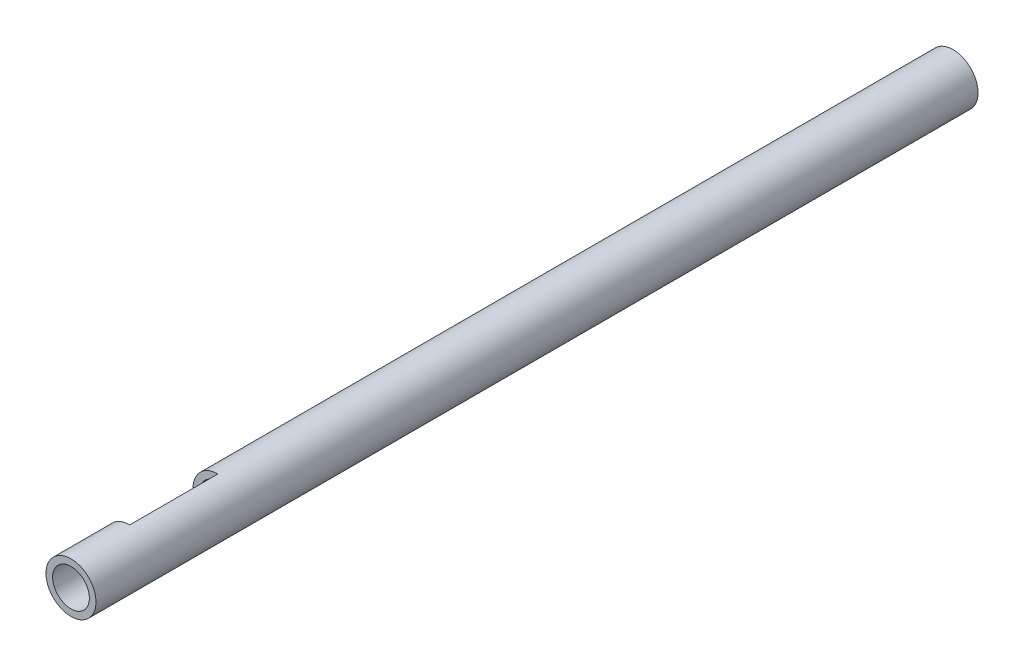
ISO-10303-21;
HEADER;
FILE_DESCRIPTION(('STEP AP214'),'2;1');
FILE_NAME('part.step','',(''),(''),'','','');
FILE_SCHEMA(('AUTOMOTIVE_DESIGN { 1 0 10303 214 1 1 1 1 }'));
ENDSEC;
DATA;
#1=APPLICATION_CONTEXT('core data for automotive mechanical design processes');
#2=APPLICATION_PROTOCOL_DEFINITION('international standard','automotive_design',2000,#1);
#3=PRODUCT_CONTEXT('',#1,'mechanical');
#4=PRODUCT('Part','Part','',(#3));
#5=PRODUCT_RELATED_PRODUCT_CATEGORY('part','',(#4));
#6=PRODUCT_DEFINITION_FORMATION('','',#4);
#7=PRODUCT_DEFINITION_CONTEXT('part definition',#1,'design');
#8=PRODUCT_DEFINITION('design','',#6,#7);
#9=PRODUCT_DEFINITION_SHAPE('','',#8);
#10=(LENGTH_UNIT() NAMED_UNIT(*) SI_UNIT(.MILLI.,.METRE.));
#11=(NAMED_UNIT(*) PLANE_ANGLE_UNIT() SI_UNIT($,.RADIAN.));
#12=(NAMED_UNIT(*) SI_UNIT($,.STERADIAN.) SOLID_ANGLE_UNIT());
#13=UNCERTAINTY_MEASURE_WITH_UNIT(LENGTH_MEASURE(1.E-05),#10,'distance_accuracy_value','');
#14=(GEOMETRIC_REPRESENTATION_CONTEXT(3) GLOBAL_UNCERTAINTY_ASSIGNED_CONTEXT((#13)) GLOBAL_UNIT_ASSIGNED_CONTEXT((#10,
#11,#12)) REPRESENTATION_CONTEXT('',''));
#15=CARTESIAN_POINT('',(0.,0.,0.));
#16=DIRECTION('',(0.,0.,1.));
#17=DIRECTION('',(1.,0.,0.));
#18=AXIS2_PLACEMENT_3D('',#15,#16,#17);
#19=CARTESIAN_POINT('',(0.,17.,0.));
#20=DIRECTION('',(0.,0.,-1.));
#21=DIRECTION('',(-1.,0.,0.));
#22=AXIS2_PLACEMENT_3D('',#19,#20,#21);
#23=PLANE('',#22);
#24=CARTESIAN_POINT('',(0.,0.,0.));
#25=DIRECTION('',(0.,0.,-1.));
#26=DIRECTION('',(-1.,0.,0.));
#27=AXIS2_PLACEMENT_3D('',#24,#25,#26);
#28=CIRCLE('',#27,17.);
#29=CARTESIAN_POINT('',(-17.,0.,0.));
#30=VERTEX_POINT('',#29);
#31=EDGE_CURVE('E103',#30,#30,#28,.T.);
#32=ORIENTED_EDGE('',*,*,#31,.T.);
#33=EDGE_LOOP('',(#32));
#34=FACE_BOUND('',#33,.T.);
#35=CARTESIAN_POINT('',(0.,0.,0.));
#36=DIRECTION('',(0.,0.,-1.));
#37=DIRECTION('',(-1.,0.,0.));
#38=AXIS2_PLACEMENT_3D('',#35,#36,#37);
#39=CIRCLE('',#38,12.5);
#40=CARTESIAN_POINT('',(-12.5,0.,0.));
#41=VERTEX_POINT('',#40);
#42=EDGE_CURVE('E112',#41,#41,#39,.T.);
#43=ORIENTED_EDGE('',*,*,#42,.F.);
#44=EDGE_LOOP('',(#43));
#45=FACE_BOUND('',#44,.T.);
#46=ADVANCED_FACE('F33',(#34,#45),#23,.T.);
#47=CARTESIAN_POINT('',(0.,0.,0.));
#48=DIRECTION('',(0.,0.,-1.));
#49=DIRECTION('',(-1.,0.,0.));
#50=AXIS2_PLACEMENT_3D('',#47,#48,#49);
#51=CYLINDRICAL_SURFACE('',#50,12.5);
#52=CARTESIAN_POINT('',(0.,0.,500.));
#53=DIRECTION('',(0.,0.,-1.));
#54=DIRECTION('',(-1.,0.,0.));
#55=AXIS2_PLACEMENT_3D('',#52,#53,#54);
#56=CIRCLE('',#55,12.5);
#57=CARTESIAN_POINT('',(0.,-12.5,500.));
#58=VERTEX_POINT('',#57);
#59=CARTESIAN_POINT('',(0.,12.5,500.));
#60=VERTEX_POINT('',#59);
#61=EDGE_CURVE('E75',#58,#60,#56,.T.);
#62=ORIENTED_EDGE('',*,*,#61,.F.);
#63=DIRECTION('',(0.,0.,-1.));
#64=VECTOR('',#63,1.);
#65=CARTESIAN_POINT('',(-1.02870331128378E-13,-12.5,0.));
#66=LINE('',#65,#64);
#67=CARTESIAN_POINT('',(0.,-12.5,560.));
#68=VERTEX_POINT('',#67);
#69=EDGE_CURVE('E100',#68,#58,#66,.T.);
#70=ORIENTED_EDGE('',*,*,#69,.F.);
#71=CARTESIAN_POINT('',(0.,0.,560.));
#72=DIRECTION('',(0.,0.,1.));
#73=DIRECTION('',(1.,0.,0.));
#74=AXIS2_PLACEMENT_3D('',#71,#72,#73);
#75=CIRCLE('',#74,12.5);
#76=CARTESIAN_POINT('',(0.,12.5,560.));
#77=VERTEX_POINT('',#76);
#78=EDGE_CURVE('E95',#77,#68,#75,.T.);
#79=ORIENTED_EDGE('',*,*,#78,.F.);
#80=DIRECTION('',(0.,0.,-1.));
#81=VECTOR('',#80,1.);
#82=CARTESIAN_POINT('',(-1.02870331128378E-13,12.5,0.));
#83=LINE('',#82,#81);
#84=EDGE_CURVE('E98',#60,#77,#83,.F.);
#85=ORIENTED_EDGE('',*,*,#84,.F.);
#86=EDGE_LOOP('',(#62,#70,#79,#85));
#87=FACE_BOUND('',#86,.T.);
#88=ORIENTED_EDGE('',*,*,#42,.T.);
#89=EDGE_LOOP('',(#88));
#90=FACE_BOUND('',#89,.T.);
#91=CARTESIAN_POINT('',(0.,0.,600.));
#92=DIRECTION('',(0.,0.,-1.));
#93=DIRECTION('',(-1.,0.,0.));
#94=AXIS2_PLACEMENT_3D('',#91,#92,#93);
#95=CIRCLE('',#94,12.4999999999999);
#96=CARTESIAN_POINT('',(-12.4999999999999,0.,600.));
#97=VERTEX_POINT('',#96);
#98=EDGE_CURVE('E109',#97,#97,#95,.T.);
#99=ORIENTED_EDGE('',*,*,#98,.F.);
#100=EDGE_LOOP('',(#99));
#101=FACE_BOUND('',#100,.T.);
#102=ADVANCED_FACE('F119',(#87,#90,#101),#51,.F.);
#103=CARTESIAN_POINT('',(0.,16.9999999999999,600.));
#104=DIRECTION('',(0.,0.,1.));
#105=DIRECTION('',(1.,0.,0.));
#106=AXIS2_PLACEMENT_3D('',#103,#104,#105);
#107=PLANE('',#106);
#108=ORIENTED_EDGE('',*,*,#98,.T.);
#109=EDGE_LOOP('',(#108));
#110=FACE_BOUND('',#109,.T.);
#111=CARTESIAN_POINT('',(0.,0.,600.));
#112=DIRECTION('',(0.,0.,-1.));
#113=DIRECTION('',(-1.,0.,0.));
#114=AXIS2_PLACEMENT_3D('',#111,#112,#113);
#115=CIRCLE('',#114,16.9999999999999);
#116=CARTESIAN_POINT('',(-16.9999999999999,0.,600.));
#117=VERTEX_POINT('',#116);
#118=EDGE_CURVE('E106',#117,#117,#115,.T.);
#119=ORIENTED_EDGE('',*,*,#118,.F.);
#120=EDGE_LOOP('',(#119));
#121=FACE_BOUND('',#120,.T.);
#122=ADVANCED_FACE('F122',(#110,#121),#107,.T.);
#123=CARTESIAN_POINT('',(0.,0.,0.));
#124=DIRECTION('',(0.,0.,-1.));
#125=DIRECTION('',(-1.,0.,0.));
#126=AXIS2_PLACEMENT_3D('',#123,#124,#125);
#127=CYLINDRICAL_SURFACE('',#126,17.);
#128=CARTESIAN_POINT('',(0.,0.,500.));
#129=DIRECTION('',(0.,0.,-1.));
#130=DIRECTION('',(-1.,0.,0.));
#131=AXIS2_PLACEMENT_3D('',#128,#129,#130);
#132=CIRCLE('',#131,17.);
#133=CARTESIAN_POINT('',(0.,17.,500.));
#134=VERTEX_POINT('',#133);
#135=CARTESIAN_POINT('',(0.,-17.,500.));
#136=VERTEX_POINT('',#135);
#137=EDGE_CURVE('E11',#134,#136,#132,.F.);
#138=ORIENTED_EDGE('',*,*,#137,.F.);
#139=DIRECTION('',(0.,0.,-1.));
#140=VECTOR('',#139,1.);
#141=CARTESIAN_POINT('',(0.,17.,500.));
#142=LINE('',#141,#140);
#143=CARTESIAN_POINT('',(0.,17.,560.));
#144=VERTEX_POINT('',#143);
#145=EDGE_CURVE('E81',#144,#134,#142,.T.);
#146=ORIENTED_EDGE('',*,*,#145,.F.);
#147=CARTESIAN_POINT('',(0.,0.,560.));
#148=DIRECTION('',(0.,0.,1.));
#149=DIRECTION('',(1.,0.,0.));
#150=AXIS2_PLACEMENT_3D('',#147,#148,#149);
#151=CIRCLE('',#150,17.);
#152=CARTESIAN_POINT('',(0.,-17.,560.));
#153=VERTEX_POINT('',#152);
#154=EDGE_CURVE('E40',#153,#144,#151,.F.);
#155=ORIENTED_EDGE('',*,*,#154,.F.);
#156=DIRECTION('',(0.,0.,-1.));
#157=VECTOR('',#156,1.);
#158=CARTESIAN_POINT('',(0.,-17.,500.));
#159=LINE('',#158,#157);
#160=EDGE_CURVE('E85',#153,#136,#159,.T.);
#161=ORIENTED_EDGE('',*,*,#160,.T.);
#162=EDGE_LOOP('',(#138,#146,#155,#161));
#163=FACE_BOUND('',#162,.T.);
#164=ORIENTED_EDGE('',*,*,#118,.T.);
#165=EDGE_LOOP('',(#164));
#166=FACE_BOUND('',#165,.T.);
#167=ORIENTED_EDGE('',*,*,#31,.F.);
#168=EDGE_LOOP('',(#167));
#169=FACE_BOUND('',#168,.T.);
#170=ADVANCED_FACE('F88',(#163,#166,#169),#127,.T.);
#171=CARTESIAN_POINT('',(0.,-17.,500.));
#172=DIRECTION('',(1.,0.,0.));
#173=DIRECTION('',(0.,0.,-1.));
#174=AXIS2_PLACEMENT_3D('',#171,#172,#173);
#175=PLANE('',#174);
#176=ORIENTED_EDGE('',*,*,#69,.T.);
#177=DIRECTION('',(0.,1.,0.));
#178=VECTOR('',#177,1.);
#179=CARTESIAN_POINT('',(0.,-17.,500.));
#180=LINE('',#179,#178);
#181=EDGE_CURVE('E77',#136,#58,#180,.T.);
#182=ORIENTED_EDGE('',*,*,#181,.F.);
#183=ORIENTED_EDGE('',*,*,#160,.F.);
#184=DIRECTION('',(0.,1.,0.));
#185=VECTOR('',#184,1.);
#186=CARTESIAN_POINT('',(0.,-17.,560.));
#187=LINE('',#186,#185);
#188=EDGE_CURVE('E78',#153,#68,#187,.T.);
#189=ORIENTED_EDGE('',*,*,#188,.T.);
#190=EDGE_LOOP('',(#176,#182,#183,#189));
#191=FACE_BOUND('',#190,.T.);
#192=ADVANCED_FACE('F117',(#191),#175,.F.);
#193=CARTESIAN_POINT('',(-37.7147515339686,-17.,500.));
#194=DIRECTION('',(0.,0.,-1.));
#195=DIRECTION('',(-1.,0.,0.));
#196=AXIS2_PLACEMENT_3D('',#193,#194,#195);
#197=PLANE('',#196);
#198=ORIENTED_EDGE('',*,*,#61,.T.);
#199=EDGE_CURVE('E69',#60,#134,#180,.T.);
#200=ORIENTED_EDGE('',*,*,#199,.T.);
#201=ORIENTED_EDGE('',*,*,#137,.T.);
#202=ORIENTED_EDGE('',*,*,#181,.T.);
#203=EDGE_LOOP('',(#198,#200,#201,#202));
#204=FACE_BOUND('',#203,.T.);
#205=ADVANCED_FACE('F70',(#204),#197,.F.);
#206=ORIENTED_EDGE('',*,*,#84,.T.);
#207=EDGE_CURVE('E47',#77,#144,#187,.T.);
#208=ORIENTED_EDGE('',*,*,#207,.T.);
#209=ORIENTED_EDGE('',*,*,#145,.T.);
#210=ORIENTED_EDGE('',*,*,#199,.F.);
#211=EDGE_LOOP('',(#206,#208,#209,#210));
#212=FACE_BOUND('',#211,.T.);
#213=ADVANCED_FACE('F82',(#212),#175,.F.);
#214=CARTESIAN_POINT('',(-37.7147515339686,-17.,560.));
#215=DIRECTION('',(0.,0.,1.));
#216=DIRECTION('',(1.,0.,0.));
#217=AXIS2_PLACEMENT_3D('',#214,#215,#216);
#218=PLANE('',#217);
#219=ORIENTED_EDGE('',*,*,#78,.T.);
#220=ORIENTED_EDGE('',*,*,#188,.F.);
#221=ORIENTED_EDGE('',*,*,#154,.T.);
#222=ORIENTED_EDGE('',*,*,#207,.F.);
#223=EDGE_LOOP('',(#219,#220,#221,#222));
#224=FACE_BOUND('',#223,.T.);
#225=ADVANCED_FACE('F114',(#224),#218,.F.);
#226=CLOSED_SHELL('',(#46,#102,#122,#170,#192,#205,#213,#225));
#227=MANIFOLD_SOLID_BREP('B2',#226);
#228=ADVANCED_BREP_SHAPE_REPRESENTATION('',(#18,#227),#14);
#229=SHAPE_DEFINITION_REPRESENTATION(#9,#228);
ENDSEC;
END-ISO-10303-21;
